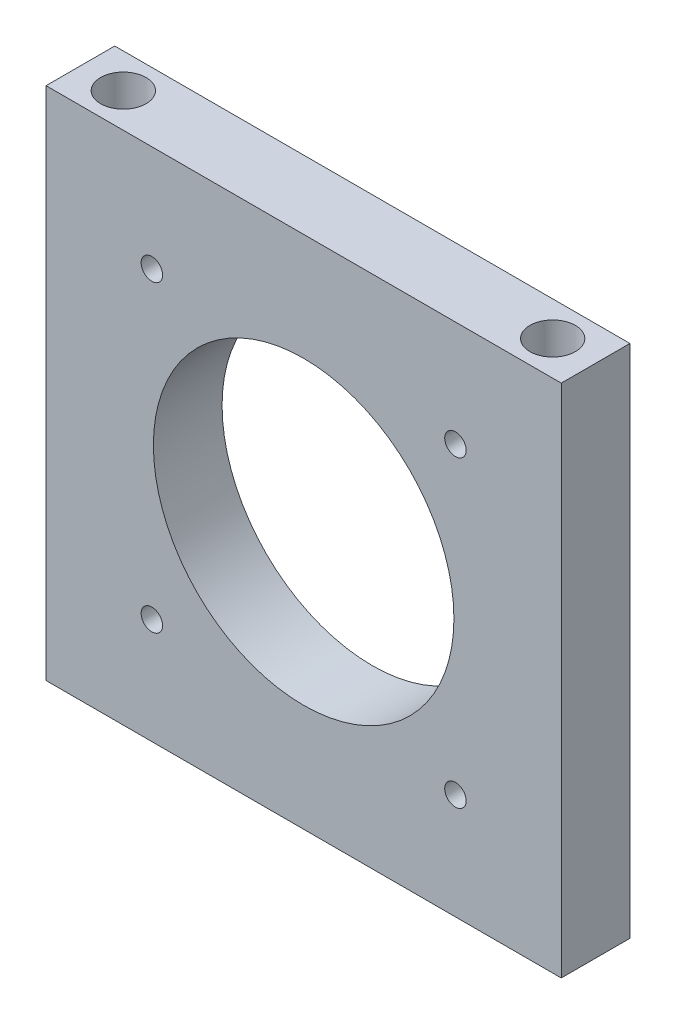
ISO-10303-21;
HEADER;
FILE_DESCRIPTION(('STEP AP214'),'2;1');
FILE_NAME('part.step','',(''),(''),'','','');
FILE_SCHEMA(('AUTOMOTIVE_DESIGN { 1 0 10303 214 1 1 1 1 }'));
ENDSEC;
DATA;
#1=APPLICATION_CONTEXT('core data for automotive mechanical design processes');
#2=APPLICATION_PROTOCOL_DEFINITION('international standard','automotive_design',2000,#1);
#3=PRODUCT_CONTEXT('',#1,'mechanical');
#4=PRODUCT('Part','Part','',(#3));
#5=PRODUCT_RELATED_PRODUCT_CATEGORY('part','',(#4));
#6=PRODUCT_DEFINITION_FORMATION('','',#4);
#7=PRODUCT_DEFINITION_CONTEXT('part definition',#1,'design');
#8=PRODUCT_DEFINITION('design','',#6,#7);
#9=PRODUCT_DEFINITION_SHAPE('','',#8);
#10=(LENGTH_UNIT() NAMED_UNIT(*) SI_UNIT(.MILLI.,.METRE.));
#11=(NAMED_UNIT(*) PLANE_ANGLE_UNIT() SI_UNIT($,.RADIAN.));
#12=(NAMED_UNIT(*) SI_UNIT($,.STERADIAN.) SOLID_ANGLE_UNIT());
#13=UNCERTAINTY_MEASURE_WITH_UNIT(LENGTH_MEASURE(1.E-05),#10,'distance_accuracy_value','');
#14=(GEOMETRIC_REPRESENTATION_CONTEXT(3) GLOBAL_UNCERTAINTY_ASSIGNED_CONTEXT((#13)) GLOBAL_UNIT_ASSIGNED_CONTEXT((#10,
#11,#12)) REPRESENTATION_CONTEXT('',''));
#15=CARTESIAN_POINT('',(0.,0.,0.));
#16=DIRECTION('',(0.,0.,1.));
#17=DIRECTION('',(1.,0.,0.));
#18=AXIS2_PLACEMENT_3D('',#15,#16,#17);
#19=CARTESIAN_POINT('',(0.,0.,-4.));
#20=DIRECTION('',(0.,0.,-1.));
#21=DIRECTION('',(-1.,0.,0.));
#22=AXIS2_PLACEMENT_3D('',#19,#20,#21);
#23=PLANE('',#22);
#24=CARTESIAN_POINT('',(17.6776695296637,17.6776695296637,-4.));
#25=DIRECTION('',(0.,0.,1.));
#26=DIRECTION('',(1.,0.,0.));
#27=AXIS2_PLACEMENT_3D('',#24,#25,#26);
#28=CIRCLE('',#27,1.25);
#29=CARTESIAN_POINT('',(18.9276695296637,17.6776695296637,-4.));
#30=VERTEX_POINT('',#29);
#31=EDGE_CURVE('E133',#30,#30,#28,.T.);
#32=ORIENTED_EDGE('',*,*,#31,.T.);
#33=EDGE_LOOP('',(#32));
#34=FACE_BOUND('',#33,.T.);
#35=CARTESIAN_POINT('',(-17.6776695296637,-17.6776695296637,-4.));
#36=DIRECTION('',(0.,0.,1.));
#37=DIRECTION('',(1.,0.,0.));
#38=AXIS2_PLACEMENT_3D('',#35,#36,#37);
#39=CIRCLE('',#38,1.25);
#40=CARTESIAN_POINT('',(-16.4276695296637,-17.6776695296637,-4.));
#41=VERTEX_POINT('',#40);
#42=EDGE_CURVE('E127',#41,#41,#39,.T.);
#43=ORIENTED_EDGE('',*,*,#42,.T.);
#44=EDGE_LOOP('',(#43));
#45=FACE_BOUND('',#44,.T.);
#46=DIRECTION('',(0.,1.,0.));
#47=VECTOR('',#46,1.);
#48=CARTESIAN_POINT('',(30.,-30.,-4.));
#49=LINE('',#48,#47);
#50=CARTESIAN_POINT('',(30.,-30.,-4.));
#51=VERTEX_POINT('',#50);
#52=CARTESIAN_POINT('',(30.,30.,-4.));
#53=VERTEX_POINT('',#52);
#54=EDGE_CURVE('E96',#51,#53,#49,.T.);
#55=ORIENTED_EDGE('',*,*,#54,.F.);
#56=DIRECTION('',(1.,0.,0.));
#57=VECTOR('',#56,1.);
#58=CARTESIAN_POINT('',(-30.,-30.,-4.));
#59=LINE('',#58,#57);
#60=CARTESIAN_POINT('',(-30.,-30.,-4.));
#61=VERTEX_POINT('',#60);
#62=EDGE_CURVE('E72',#61,#51,#59,.T.);
#63=ORIENTED_EDGE('',*,*,#62,.F.);
#64=DIRECTION('',(0.,-1.,0.));
#65=VECTOR('',#64,1.);
#66=CARTESIAN_POINT('',(-30.,-30.,-4.));
#67=LINE('',#66,#65);
#68=CARTESIAN_POINT('',(-30.,30.,-4.));
#69=VERTEX_POINT('',#68);
#70=EDGE_CURVE('E66',#69,#61,#67,.T.);
#71=ORIENTED_EDGE('',*,*,#70,.F.);
#72=DIRECTION('',(-1.,0.,0.));
#73=VECTOR('',#72,1.);
#74=CARTESIAN_POINT('',(-30.,30.,-4.));
#75=LINE('',#74,#73);
#76=EDGE_CURVE('E88',#53,#69,#75,.T.);
#77=ORIENTED_EDGE('',*,*,#76,.F.);
#78=EDGE_LOOP('',(#55,#63,#71,#77));
#79=FACE_BOUND('',#78,.T.);
#80=CARTESIAN_POINT('',(0.,0.,-4.));
#81=DIRECTION('',(0.,0.,1.));
#82=DIRECTION('',(1.,0.,0.));
#83=AXIS2_PLACEMENT_3D('',#80,#81,#82);
#84=CIRCLE('',#83,17.5);
#85=CARTESIAN_POINT('',(17.5,0.,-4.));
#86=VERTEX_POINT('',#85);
#87=EDGE_CURVE('E99',#86,#86,#84,.T.);
#88=ORIENTED_EDGE('',*,*,#87,.T.);
#89=EDGE_LOOP('',(#88));
#90=FACE_BOUND('',#89,.T.);
#91=CARTESIAN_POINT('',(17.6776695296637,-17.6776695296637,-4.));
#92=DIRECTION('',(0.,0.,1.));
#93=DIRECTION('',(1.,0.,0.));
#94=AXIS2_PLACEMENT_3D('',#91,#92,#93);
#95=CIRCLE('',#94,1.25);
#96=CARTESIAN_POINT('',(18.9276695296637,-17.6776695296637,-4.));
#97=VERTEX_POINT('',#96);
#98=EDGE_CURVE('E113',#97,#97,#95,.T.);
#99=ORIENTED_EDGE('',*,*,#98,.T.);
#100=EDGE_LOOP('',(#99));
#101=FACE_BOUND('',#100,.T.);
#102=CARTESIAN_POINT('',(-17.6776695296637,17.6776695296637,-4.));
#103=DIRECTION('',(0.,0.,1.));
#104=DIRECTION('',(1.,0.,0.));
#105=AXIS2_PLACEMENT_3D('',#102,#103,#104);
#106=CIRCLE('',#105,1.25);
#107=CARTESIAN_POINT('',(-16.4276695296637,17.6776695296637,-4.));
#108=VERTEX_POINT('',#107);
#109=EDGE_CURVE('E121',#108,#108,#106,.T.);
#110=ORIENTED_EDGE('',*,*,#109,.T.);
#111=EDGE_LOOP('',(#110));
#112=FACE_BOUND('',#111,.T.);
#113=ADVANCED_FACE('F32',(#34,#45,#79,#90,#101,#112),#23,.T.);
#114=CARTESIAN_POINT('',(30.,-30.,4.));
#115=DIRECTION('',(-1.,0.,0.));
#116=DIRECTION('',(0.,0.,1.));
#117=AXIS2_PLACEMENT_3D('',#114,#115,#116);
#118=PLANE('',#117);
#119=ORIENTED_EDGE('',*,*,#54,.T.);
#120=DIRECTION('',(0.,0.,-1.));
#121=VECTOR('',#120,1.);
#122=CARTESIAN_POINT('',(30.,30.,4.));
#123=LINE('',#122,#121);
#124=CARTESIAN_POINT('',(30.,30.,4.));
#125=VERTEX_POINT('',#124);
#126=EDGE_CURVE('E11',#125,#53,#123,.T.);
#127=ORIENTED_EDGE('',*,*,#126,.F.);
#128=DIRECTION('',(0.,1.,0.));
#129=VECTOR('',#128,1.);
#130=CARTESIAN_POINT('',(30.,-30.,4.));
#131=LINE('',#130,#129);
#132=CARTESIAN_POINT('',(30.,-30.,4.));
#133=VERTEX_POINT('',#132);
#134=EDGE_CURVE('E84',#133,#125,#131,.T.);
#135=ORIENTED_EDGE('',*,*,#134,.F.);
#136=DIRECTION('',(0.,0.,-1.));
#137=VECTOR('',#136,1.);
#138=CARTESIAN_POINT('',(30.,-30.,4.));
#139=LINE('',#138,#137);
#140=EDGE_CURVE('E92',#133,#51,#139,.T.);
#141=ORIENTED_EDGE('',*,*,#140,.T.);
#142=EDGE_LOOP('',(#119,#127,#135,#141));
#143=FACE_BOUND('',#142,.T.);
#144=ADVANCED_FACE('F34',(#143),#118,.F.);
#145=CARTESIAN_POINT('',(-30.,30.,4.));
#146=DIRECTION('',(0.,-1.,0.));
#147=DIRECTION('',(0.,0.,-1.));
#148=AXIS2_PLACEMENT_3D('',#145,#146,#147);
#149=PLANE('',#148);
#150=CARTESIAN_POINT('',(-25.,30.,0.));
#151=DIRECTION('',(0.,1.,0.));
#152=DIRECTION('',(0.,0.,1.));
#153=AXIS2_PLACEMENT_3D('',#150,#151,#152);
#154=CIRCLE('',#153,2.64999999999999);
#155=CARTESIAN_POINT('',(-25.,30.,2.64999999999999));
#156=VERTEX_POINT('',#155);
#157=EDGE_CURVE('E148',#156,#156,#154,.T.);
#158=ORIENTED_EDGE('',*,*,#157,.F.);
#159=EDGE_LOOP('',(#158));
#160=FACE_BOUND('',#159,.T.);
#161=CARTESIAN_POINT('',(25.,30.,0.));
#162=DIRECTION('',(0.,1.,0.));
#163=DIRECTION('',(0.,0.,1.));
#164=AXIS2_PLACEMENT_3D('',#161,#162,#163);
#165=CIRCLE('',#164,2.64999999999999);
#166=CARTESIAN_POINT('',(25.,30.,2.64999999999999));
#167=VERTEX_POINT('',#166);
#168=EDGE_CURVE('E142',#167,#167,#165,.T.);
#169=ORIENTED_EDGE('',*,*,#168,.F.);
#170=EDGE_LOOP('',(#169));
#171=FACE_BOUND('',#170,.T.);
#172=ORIENTED_EDGE('',*,*,#76,.T.);
#173=DIRECTION('',(0.,0.,-1.));
#174=VECTOR('',#173,1.);
#175=CARTESIAN_POINT('',(-30.,30.,4.));
#176=LINE('',#175,#174);
#177=CARTESIAN_POINT('',(-30.,30.,4.));
#178=VERTEX_POINT('',#177);
#179=EDGE_CURVE('E41',#178,#69,#176,.T.);
#180=ORIENTED_EDGE('',*,*,#179,.F.);
#181=DIRECTION('',(-1.,0.,0.));
#182=VECTOR('',#181,1.);
#183=CARTESIAN_POINT('',(-30.,30.,4.));
#184=LINE('',#183,#182);
#185=EDGE_CURVE('E79',#125,#178,#184,.T.);
#186=ORIENTED_EDGE('',*,*,#185,.F.);
#187=ORIENTED_EDGE('',*,*,#126,.T.);
#188=EDGE_LOOP('',(#172,#180,#186,#187));
#189=FACE_BOUND('',#188,.T.);
#190=ADVANCED_FACE('F87',(#160,#171,#189),#149,.F.);
#191=CARTESIAN_POINT('',(-30.,-30.,4.));
#192=DIRECTION('',(1.,0.,0.));
#193=DIRECTION('',(0.,0.,-1.));
#194=AXIS2_PLACEMENT_3D('',#191,#192,#193);
#195=PLANE('',#194);
#196=ORIENTED_EDGE('',*,*,#70,.T.);
#197=DIRECTION('',(0.,0.,-1.));
#198=VECTOR('',#197,1.);
#199=CARTESIAN_POINT('',(-30.,-30.,4.));
#200=LINE('',#199,#198);
#201=CARTESIAN_POINT('',(-30.,-30.,4.));
#202=VERTEX_POINT('',#201);
#203=EDGE_CURVE('E89',#202,#61,#200,.T.);
#204=ORIENTED_EDGE('',*,*,#203,.F.);
#205=DIRECTION('',(0.,-1.,0.));
#206=VECTOR('',#205,1.);
#207=CARTESIAN_POINT('',(-30.,-30.,4.));
#208=LINE('',#207,#206);
#209=EDGE_CURVE('E82',#178,#202,#208,.T.);
#210=ORIENTED_EDGE('',*,*,#209,.F.);
#211=ORIENTED_EDGE('',*,*,#179,.T.);
#212=EDGE_LOOP('',(#196,#204,#210,#211));
#213=FACE_BOUND('',#212,.T.);
#214=ADVANCED_FACE('F90',(#213),#195,.F.);
#215=CARTESIAN_POINT('',(-30.,-30.,4.));
#216=DIRECTION('',(0.,1.,0.));
#217=DIRECTION('',(0.,0.,1.));
#218=AXIS2_PLACEMENT_3D('',#215,#216,#217);
#219=PLANE('',#218);
#220=CARTESIAN_POINT('',(-25.,-30.,0.));
#221=DIRECTION('',(0.,1.,0.));
#222=DIRECTION('',(0.,0.,1.));
#223=AXIS2_PLACEMENT_3D('',#220,#221,#222);
#224=CIRCLE('',#223,2.64999999999999);
#225=CARTESIAN_POINT('',(-25.,-30.,2.64999999999999));
#226=VERTEX_POINT('',#225);
#227=EDGE_CURVE('E145',#226,#226,#224,.T.);
#228=ORIENTED_EDGE('',*,*,#227,.T.);
#229=EDGE_LOOP('',(#228));
#230=FACE_BOUND('',#229,.T.);
#231=CARTESIAN_POINT('',(25.,-30.,0.));
#232=DIRECTION('',(0.,1.,0.));
#233=DIRECTION('',(0.,0.,1.));
#234=AXIS2_PLACEMENT_3D('',#231,#232,#233);
#235=CIRCLE('',#234,2.64999999999999);
#236=CARTESIAN_POINT('',(25.,-30.,2.64999999999999));
#237=VERTEX_POINT('',#236);
#238=EDGE_CURVE('E139',#237,#237,#235,.T.);
#239=ORIENTED_EDGE('',*,*,#238,.T.);
#240=EDGE_LOOP('',(#239));
#241=FACE_BOUND('',#240,.T.);
#242=ORIENTED_EDGE('',*,*,#62,.T.);
#243=ORIENTED_EDGE('',*,*,#140,.F.);
#244=DIRECTION('',(1.,0.,0.));
#245=VECTOR('',#244,1.);
#246=CARTESIAN_POINT('',(-30.,-30.,4.));
#247=LINE('',#246,#245);
#248=EDGE_CURVE('E49',#202,#133,#247,.T.);
#249=ORIENTED_EDGE('',*,*,#248,.F.);
#250=ORIENTED_EDGE('',*,*,#203,.T.);
#251=EDGE_LOOP('',(#242,#243,#249,#250));
#252=FACE_BOUND('',#251,.T.);
#253=ADVANCED_FACE('F104',(#230,#241,#252),#219,.F.);
#254=CARTESIAN_POINT('',(0.,0.,4.));
#255=DIRECTION('',(0.,0.,-1.));
#256=DIRECTION('',(-1.,0.,0.));
#257=AXIS2_PLACEMENT_3D('',#254,#255,#256);
#258=PLANE('',#257);
#259=CARTESIAN_POINT('',(17.6776695296637,17.6776695296637,4.));
#260=DIRECTION('',(0.,0.,1.));
#261=DIRECTION('',(1.,0.,0.));
#262=AXIS2_PLACEMENT_3D('',#259,#260,#261);
#263=CIRCLE('',#262,1.25);
#264=CARTESIAN_POINT('',(18.9276695296637,17.6776695296637,4.));
#265=VERTEX_POINT('',#264);
#266=EDGE_CURVE('E136',#265,#265,#263,.T.);
#267=ORIENTED_EDGE('',*,*,#266,.F.);
#268=EDGE_LOOP('',(#267));
#269=FACE_BOUND('',#268,.T.);
#270=CARTESIAN_POINT('',(-17.6776695296637,-17.6776695296637,4.));
#271=DIRECTION('',(0.,0.,1.));
#272=DIRECTION('',(1.,0.,0.));
#273=AXIS2_PLACEMENT_3D('',#270,#271,#272);
#274=CIRCLE('',#273,1.25);
#275=CARTESIAN_POINT('',(-16.4276695296637,-17.6776695296637,4.));
#276=VERTEX_POINT('',#275);
#277=EDGE_CURVE('E130',#276,#276,#274,.T.);
#278=ORIENTED_EDGE('',*,*,#277,.F.);
#279=EDGE_LOOP('',(#278));
#280=FACE_BOUND('',#279,.T.);
#281=CARTESIAN_POINT('',(-17.6776695296637,17.6776695296637,4.));
#282=DIRECTION('',(0.,0.,1.));
#283=DIRECTION('',(1.,0.,0.));
#284=AXIS2_PLACEMENT_3D('',#281,#282,#283);
#285=CIRCLE('',#284,1.25);
#286=CARTESIAN_POINT('',(-16.4276695296637,17.6776695296637,4.));
#287=VERTEX_POINT('',#286);
#288=EDGE_CURVE('E124',#287,#287,#285,.T.);
#289=ORIENTED_EDGE('',*,*,#288,.F.);
#290=EDGE_LOOP('',(#289));
#291=FACE_BOUND('',#290,.T.);
#292=CARTESIAN_POINT('',(17.6776695296637,-17.6776695296637,4.));
#293=DIRECTION('',(0.,0.,1.));
#294=DIRECTION('',(1.,0.,0.));
#295=AXIS2_PLACEMENT_3D('',#292,#293,#294);
#296=CIRCLE('',#295,1.25);
#297=CARTESIAN_POINT('',(18.9276695296637,-17.6776695296637,4.));
#298=VERTEX_POINT('',#297);
#299=EDGE_CURVE('E118',#298,#298,#296,.T.);
#300=ORIENTED_EDGE('',*,*,#299,.F.);
#301=EDGE_LOOP('',(#300));
#302=FACE_BOUND('',#301,.T.);
#303=CARTESIAN_POINT('',(0.,0.,4.));
#304=DIRECTION('',(0.,0.,1.));
#305=DIRECTION('',(1.,0.,0.));
#306=AXIS2_PLACEMENT_3D('',#303,#304,#305);
#307=CIRCLE('',#306,17.5);
#308=CARTESIAN_POINT('',(17.5,0.,4.));
#309=VERTEX_POINT('',#308);
#310=EDGE_CURVE('E110',#309,#309,#307,.T.);
#311=ORIENTED_EDGE('',*,*,#310,.F.);
#312=EDGE_LOOP('',(#311));
#313=FACE_BOUND('',#312,.T.);
#314=ORIENTED_EDGE('',*,*,#134,.T.);
#315=ORIENTED_EDGE('',*,*,#185,.T.);
#316=ORIENTED_EDGE('',*,*,#209,.T.);
#317=ORIENTED_EDGE('',*,*,#248,.T.);
#318=EDGE_LOOP('',(#314,#315,#316,#317));
#319=FACE_BOUND('',#318,.T.);
#320=ADVANCED_FACE('F80',(#269,#280,#291,#302,#313,#319),#258,.F.);
#321=CARTESIAN_POINT('',(0.,0.,-4.));
#322=DIRECTION('',(0.,0.,1.));
#323=DIRECTION('',(1.,0.,0.));
#324=AXIS2_PLACEMENT_3D('',#321,#322,#323);
#325=CYLINDRICAL_SURFACE('',#324,17.5);
#326=ORIENTED_EDGE('',*,*,#87,.F.);
#327=EDGE_LOOP('',(#326));
#328=FACE_BOUND('',#327,.T.);
#329=ORIENTED_EDGE('',*,*,#310,.T.);
#330=EDGE_LOOP('',(#329));
#331=FACE_BOUND('',#330,.T.);
#332=ADVANCED_FACE('F203',(#328,#331),#325,.F.);
#333=CARTESIAN_POINT('',(17.6776695296637,-17.6776695296637,4.));
#334=DIRECTION('',(0.,0.,1.));
#335=DIRECTION('',(1.,0.,0.));
#336=AXIS2_PLACEMENT_3D('',#333,#334,#335);
#337=CYLINDRICAL_SURFACE('',#336,1.25);
#338=ORIENTED_EDGE('',*,*,#98,.F.);
#339=EDGE_LOOP('',(#338));
#340=FACE_BOUND('',#339,.T.);
#341=ORIENTED_EDGE('',*,*,#299,.T.);
#342=EDGE_LOOP('',(#341));
#343=FACE_BOUND('',#342,.T.);
#344=ADVANCED_FACE('F210',(#340,#343),#337,.F.);
#345=CARTESIAN_POINT('',(-17.6776695296637,17.6776695296637,4.));
#346=DIRECTION('',(0.,0.,1.));
#347=DIRECTION('',(1.,0.,0.));
#348=AXIS2_PLACEMENT_3D('',#345,#346,#347);
#349=CYLINDRICAL_SURFACE('',#348,1.25);
#350=ORIENTED_EDGE('',*,*,#109,.F.);
#351=EDGE_LOOP('',(#350));
#352=FACE_BOUND('',#351,.T.);
#353=ORIENTED_EDGE('',*,*,#288,.T.);
#354=EDGE_LOOP('',(#353));
#355=FACE_BOUND('',#354,.T.);
#356=ADVANCED_FACE('F216',(#352,#355),#349,.F.);
#357=CARTESIAN_POINT('',(-17.6776695296637,-17.6776695296637,4.));
#358=DIRECTION('',(0.,0.,1.));
#359=DIRECTION('',(1.,0.,0.));
#360=AXIS2_PLACEMENT_3D('',#357,#358,#359);
#361=CYLINDRICAL_SURFACE('',#360,1.25);
#362=ORIENTED_EDGE('',*,*,#42,.F.);
#363=EDGE_LOOP('',(#362));
#364=FACE_BOUND('',#363,.T.);
#365=ORIENTED_EDGE('',*,*,#277,.T.);
#366=EDGE_LOOP('',(#365));
#367=FACE_BOUND('',#366,.T.);
#368=ADVANCED_FACE('F169',(#364,#367),#361,.F.);
#369=CARTESIAN_POINT('',(17.6776695296637,17.6776695296637,4.));
#370=DIRECTION('',(0.,0.,1.));
#371=DIRECTION('',(1.,0.,0.));
#372=AXIS2_PLACEMENT_3D('',#369,#370,#371);
#373=CYLINDRICAL_SURFACE('',#372,1.25);
#374=ORIENTED_EDGE('',*,*,#31,.F.);
#375=EDGE_LOOP('',(#374));
#376=FACE_BOUND('',#375,.T.);
#377=ORIENTED_EDGE('',*,*,#266,.T.);
#378=EDGE_LOOP('',(#377));
#379=FACE_BOUND('',#378,.T.);
#380=ADVANCED_FACE('F160',(#376,#379),#373,.F.);
#381=CARTESIAN_POINT('',(25.,30.,0.));
#382=DIRECTION('',(0.,1.,0.));
#383=DIRECTION('',(0.,0.,1.));
#384=AXIS2_PLACEMENT_3D('',#381,#382,#383);
#385=CYLINDRICAL_SURFACE('',#384,2.64999999999999);
#386=ORIENTED_EDGE('',*,*,#238,.F.);
#387=EDGE_LOOP('',(#386));
#388=FACE_BOUND('',#387,.T.);
#389=ORIENTED_EDGE('',*,*,#168,.T.);
#390=EDGE_LOOP('',(#389));
#391=FACE_BOUND('',#390,.T.);
#392=ADVANCED_FACE('F158',(#388,#391),#385,.F.);
#393=CARTESIAN_POINT('',(-25.,30.,0.));
#394=DIRECTION('',(0.,1.,0.));
#395=DIRECTION('',(0.,0.,1.));
#396=AXIS2_PLACEMENT_3D('',#393,#394,#395);
#397=CYLINDRICAL_SURFACE('',#396,2.64999999999999);
#398=ORIENTED_EDGE('',*,*,#227,.F.);
#399=EDGE_LOOP('',(#398));
#400=FACE_BOUND('',#399,.T.);
#401=ORIENTED_EDGE('',*,*,#157,.T.);
#402=EDGE_LOOP('',(#401));
#403=FACE_BOUND('',#402,.T.);
#404=ADVANCED_FACE('F152',(#400,#403),#397,.F.);
#405=CLOSED_SHELL('',(#113,#144,#190,#214,#253,#320,#332,#344,#356,#368,#380,#392,#404));
#406=MANIFOLD_SOLID_BREP('B2',#405);
#407=ADVANCED_BREP_SHAPE_REPRESENTATION('',(#18,#406),#14);
#408=SHAPE_DEFINITION_REPRESENTATION(#9,#407);
ENDSEC;
END-ISO-10303-21;
